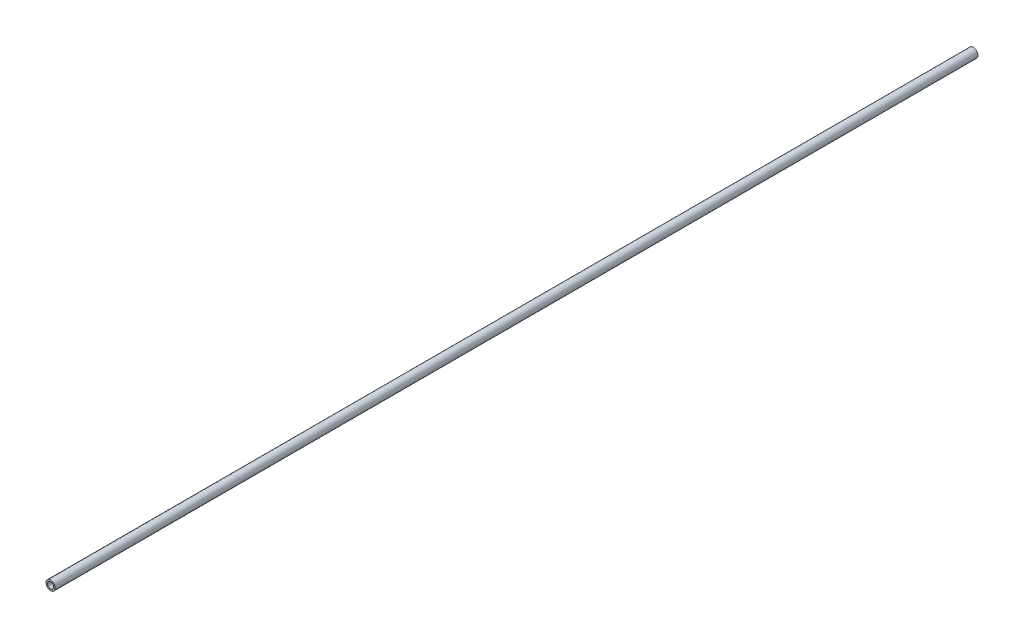
ISO-10303-21;
HEADER;
FILE_DESCRIPTION(('STEP AP214'),'2;1');
FILE_NAME('part.step','',(''),(''),'','','');
FILE_SCHEMA(('AUTOMOTIVE_DESIGN { 1 0 10303 214 1 1 1 1 }'));
ENDSEC;
DATA;
#1=APPLICATION_CONTEXT('core data for automotive mechanical design processes');
#2=APPLICATION_PROTOCOL_DEFINITION('international standard','automotive_design',2000,#1);
#3=PRODUCT_CONTEXT('',#1,'mechanical');
#4=PRODUCT('Part','Part','',(#3));
#5=PRODUCT_RELATED_PRODUCT_CATEGORY('part','',(#4));
#6=PRODUCT_DEFINITION_FORMATION('','',#4);
#7=PRODUCT_DEFINITION_CONTEXT('part definition',#1,'design');
#8=PRODUCT_DEFINITION('design','',#6,#7);
#9=PRODUCT_DEFINITION_SHAPE('','',#8);
#10=(LENGTH_UNIT() NAMED_UNIT(*) SI_UNIT(.MILLI.,.METRE.));
#11=(NAMED_UNIT(*) PLANE_ANGLE_UNIT() SI_UNIT($,.RADIAN.));
#12=(NAMED_UNIT(*) SI_UNIT($,.STERADIAN.) SOLID_ANGLE_UNIT());
#13=UNCERTAINTY_MEASURE_WITH_UNIT(LENGTH_MEASURE(1.E-05),#10,'distance_accuracy_value','');
#14=(GEOMETRIC_REPRESENTATION_CONTEXT(3) GLOBAL_UNCERTAINTY_ASSIGNED_CONTEXT((#13)) GLOBAL_UNIT_ASSIGNED_CONTEXT((#10,
#11,#12)) REPRESENTATION_CONTEXT('',''));
#15=CARTESIAN_POINT('',(0.,0.,0.));
#16=DIRECTION('',(0.,0.,1.));
#17=DIRECTION('',(1.,0.,0.));
#18=AXIS2_PLACEMENT_3D('',#15,#16,#17);
#19=CARTESIAN_POINT('',(0.,0.,599.));
#20=DIRECTION('',(0.,0.,1.));
#21=DIRECTION('',(1.,0.,0.));
#22=AXIS2_PLACEMENT_3D('',#19,#20,#21);
#23=PLANE('',#22);
#24=CARTESIAN_POINT('',(0.,0.,599.));
#25=DIRECTION('',(0.,0.,1.));
#26=DIRECTION('',(1.,0.,0.));
#27=AXIS2_PLACEMENT_3D('',#24,#25,#26);
#28=CIRCLE('',#27,3.);
#29=CARTESIAN_POINT('',(3.,0.,599.));
#30=VERTEX_POINT('',#29);
#31=EDGE_CURVE('E10',#30,#30,#28,.T.);
#32=ORIENTED_EDGE('',*,*,#31,.T.);
#33=EDGE_LOOP('',(#32));
#34=FACE_BOUND('',#33,.T.);
#35=CARTESIAN_POINT('',(0.,0.,599.));
#36=DIRECTION('',(0.,0.,1.));
#37=DIRECTION('',(1.,0.,0.));
#38=AXIS2_PLACEMENT_3D('',#35,#36,#37);
#39=CIRCLE('',#38,2.);
#40=CARTESIAN_POINT('',(2.,0.,599.));
#41=VERTEX_POINT('',#40);
#42=EDGE_CURVE('E44',#41,#41,#39,.T.);
#43=ORIENTED_EDGE('',*,*,#42,.F.);
#44=EDGE_LOOP('',(#43));
#45=FACE_BOUND('',#44,.T.);
#46=ADVANCED_FACE('F33',(#34,#45),#23,.T.);
#47=CARTESIAN_POINT('',(0.,0.,0.));
#48=DIRECTION('',(0.,0.,1.));
#49=DIRECTION('',(1.,0.,0.));
#50=AXIS2_PLACEMENT_3D('',#47,#48,#49);
#51=PLANE('',#50);
#52=CARTESIAN_POINT('',(0.,0.,0.));
#53=DIRECTION('',(0.,0.,1.));
#54=DIRECTION('',(1.,0.,0.));
#55=AXIS2_PLACEMENT_3D('',#52,#53,#54);
#56=CIRCLE('',#55,3.);
#57=CARTESIAN_POINT('',(3.,0.,0.));
#58=VERTEX_POINT('',#57);
#59=EDGE_CURVE('E37',#58,#58,#56,.T.);
#60=ORIENTED_EDGE('',*,*,#59,.F.);
#61=EDGE_LOOP('',(#60));
#62=FACE_BOUND('',#61,.T.);
#63=CARTESIAN_POINT('',(0.,0.,0.));
#64=DIRECTION('',(0.,0.,1.));
#65=DIRECTION('',(1.,0.,0.));
#66=AXIS2_PLACEMENT_3D('',#63,#64,#65);
#67=CIRCLE('',#66,2.);
#68=CARTESIAN_POINT('',(2.,0.,0.));
#69=VERTEX_POINT('',#68);
#70=EDGE_CURVE('E46',#69,#69,#67,.T.);
#71=ORIENTED_EDGE('',*,*,#70,.T.);
#72=EDGE_LOOP('',(#71));
#73=FACE_BOUND('',#72,.T.);
#74=ADVANCED_FACE('F56',(#62,#73),#51,.F.);
#75=CARTESIAN_POINT('',(0.,0.,599.));
#76=DIRECTION('',(0.,0.,-1.));
#77=DIRECTION('',(-1.,0.,0.));
#78=AXIS2_PLACEMENT_3D('',#75,#76,#77);
#79=CYLINDRICAL_SURFACE('',#78,3.);
#80=ORIENTED_EDGE('',*,*,#31,.F.);
#81=EDGE_LOOP('',(#80));
#82=FACE_BOUND('',#81,.T.);
#83=ORIENTED_EDGE('',*,*,#59,.T.);
#84=EDGE_LOOP('',(#83));
#85=FACE_BOUND('',#84,.T.);
#86=ADVANCED_FACE('F35',(#82,#85),#79,.T.);
#87=CARTESIAN_POINT('',(0.,0.,599.));
#88=DIRECTION('',(0.,0.,-1.));
#89=DIRECTION('',(-1.,0.,0.));
#90=AXIS2_PLACEMENT_3D('',#87,#88,#89);
#91=CYLINDRICAL_SURFACE('',#90,2.);
#92=ORIENTED_EDGE('',*,*,#42,.T.);
#93=EDGE_LOOP('',(#92));
#94=FACE_BOUND('',#93,.T.);
#95=ORIENTED_EDGE('',*,*,#70,.F.);
#96=EDGE_LOOP('',(#95));
#97=FACE_BOUND('',#96,.T.);
#98=ADVANCED_FACE('F52',(#94,#97),#91,.F.);
#99=CLOSED_SHELL('',(#46,#74,#86,#98));
#100=MANIFOLD_SOLID_BREP('B2',#99);
#101=ADVANCED_BREP_SHAPE_REPRESENTATION('',(#18,#100),#14);
#102=SHAPE_DEFINITION_REPRESENTATION(#9,#101);
ENDSEC;
END-ISO-10303-21;
